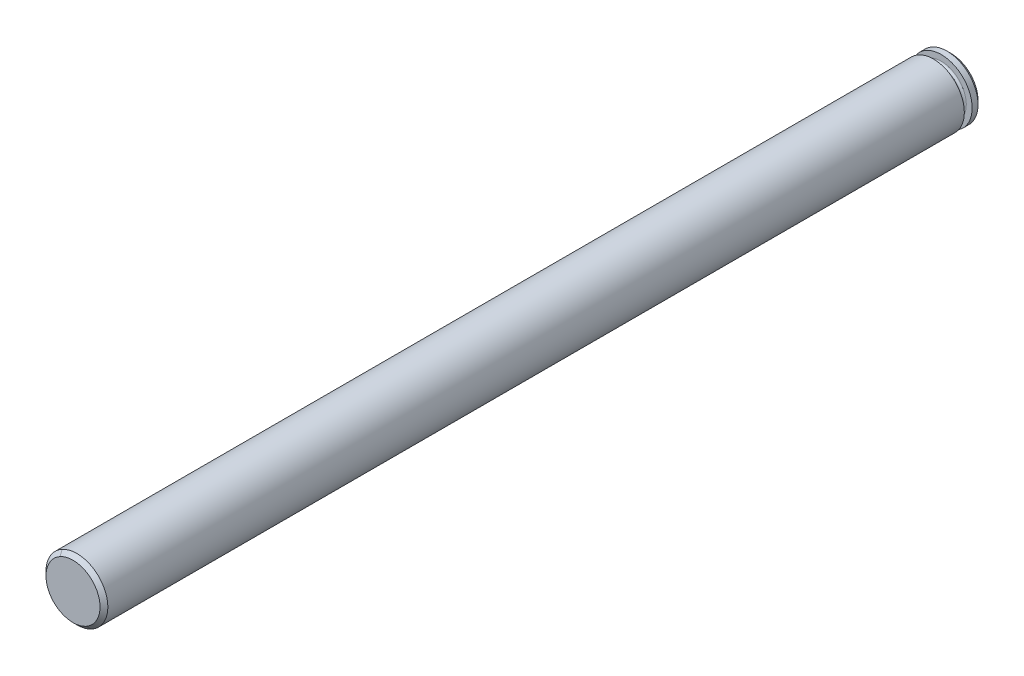
ISO-10303-21;
HEADER;
FILE_DESCRIPTION(('STEP AP214'),'2;1');
FILE_NAME('part.step','',(''),(''),'','','');
FILE_SCHEMA(('AUTOMOTIVE_DESIGN { 1 0 10303 214 1 1 1 1 }'));
ENDSEC;
DATA;
#1=APPLICATION_CONTEXT('core data for automotive mechanical design processes');
#2=APPLICATION_PROTOCOL_DEFINITION('international standard','automotive_design',2000,#1);
#3=PRODUCT_CONTEXT('',#1,'mechanical');
#4=PRODUCT('Part','Part','',(#3));
#5=PRODUCT_RELATED_PRODUCT_CATEGORY('part','',(#4));
#6=PRODUCT_DEFINITION_FORMATION('','',#4);
#7=PRODUCT_DEFINITION_CONTEXT('part definition',#1,'design');
#8=PRODUCT_DEFINITION('design','',#6,#7);
#9=PRODUCT_DEFINITION_SHAPE('','',#8);
#10=(LENGTH_UNIT() NAMED_UNIT(*) SI_UNIT(.MILLI.,.METRE.));
#11=(NAMED_UNIT(*) PLANE_ANGLE_UNIT() SI_UNIT($,.RADIAN.));
#12=(NAMED_UNIT(*) SI_UNIT($,.STERADIAN.) SOLID_ANGLE_UNIT());
#13=UNCERTAINTY_MEASURE_WITH_UNIT(LENGTH_MEASURE(1.E-05),#10,'distance_accuracy_value','');
#14=(GEOMETRIC_REPRESENTATION_CONTEXT(3) GLOBAL_UNCERTAINTY_ASSIGNED_CONTEXT((#13)) GLOBAL_UNIT_ASSIGNED_CONTEXT((#10,
#11,#12)) REPRESENTATION_CONTEXT('',''));
#15=CARTESIAN_POINT('',(0.,0.,0.));
#16=DIRECTION('',(0.,0.,1.));
#17=DIRECTION('',(1.,0.,0.));
#18=AXIS2_PLACEMENT_3D('',#15,#16,#17);
#19=CARTESIAN_POINT('',(0.,0.,0.));
#20=DIRECTION('',(0.,0.,1.));
#21=DIRECTION('',(1.,0.,0.));
#22=AXIS2_PLACEMENT_3D('',#19,#20,#21);
#23=PLANE('',#22);
#24=CARTESIAN_POINT('',(0.,0.,-1.13684533791999E-10));
#25=DIRECTION('',(0.,0.,1.));
#26=DIRECTION('',(1.,0.,0.));
#27=AXIS2_PLACEMENT_3D('',#24,#25,#26);
#28=CIRCLE('',#27,1.38499999997066);
#29=CARTESIAN_POINT('',(-0.66400437095998,1.21545184822052,-3.04662098749089E-11));
#30=VERTEX_POINT('',#29);
#31=CARTESIAN_POINT('',(0.664003718689585,-1.21545220462232,2.83070135728416E-11));
#32=VERTEX_POINT('',#31);
#33=EDGE_CURVE('E144',#30,#32,#28,.T.);
#34=ORIENTED_EDGE('',*,*,#33,.F.);
#35=CARTESIAN_POINT('',(0.,-3.1170880873187E-13,5.46819263046866E-11));
#36=DIRECTION('',(0.,1.56071244751136E-12,1.));
#37=DIRECTION('',(0.,-1.,1.56071244751136E-12));
#38=AXIS2_PLACEMENT_3D('',#35,#36,#37);
#39=CIRCLE('',#38,1.38500000002719);
#40=EDGE_CURVE('E21',#32,#30,#39,.T.);
#41=ORIENTED_EDGE('',*,*,#40,.F.);
#42=EDGE_LOOP('',(#34,#41));
#43=FACE_BOUND('',#42,.T.);
#44=ADVANCED_FACE('F17',(#43),#23,.F.);
#45=CARTESIAN_POINT('',(0.,0.,0.200000000117852));
#46=DIRECTION('',(0.,1.56071244751136E-12,1.));
#47=DIRECTION('',(0.,-1.,1.56071244751136E-12));
#48=AXIS2_PLACEMENT_3D('',#45,#46,#47);
#49=CONICAL_SURFACE('',#48,1.5849999999773,0.785398163114792);
#50=CARTESIAN_POINT('',(0.664003718703219,-1.21545220464728,0.));
#51=CARTESIAN_POINT('',(0.667998954785312,-1.2227653799699,0.00833333331681347));
#52=CARTESIAN_POINT('',(0.671994191348765,-1.23007855500759,0.0166666666529012));
#53=CARTESIAN_POINT('',(0.679984665447788,-1.2447049045303,0.0333333333250767));
#54=CARTESIAN_POINT('',(0.683979902983358,-1.25201807901532,0.0416666666611645));
#55=CARTESIAN_POINT('',(0.691970379049638,-1.26664442747485,0.0583333333232102));
#56=CARTESIAN_POINT('',(0.695965617580349,-1.27395760144936,0.0666666666491682));
#57=CARTESIAN_POINT('',(0.703956095626256,-1.28858394886835,0.0833333333321294));
#58=CARTESIAN_POINT('',(0.707951335141453,-1.29589712231283,0.0916666666891326));
#59=CARTESIAN_POINT('',(0.715941815144136,-1.31052346864946,0.108333333326983));
#60=CARTESIAN_POINT('',(0.719937055631622,-1.3178366415416,0.116666666607831));
#61=CARTESIAN_POINT('',(0.727927537592898,-1.33246298679919,0.133333333272573));
#62=CARTESIAN_POINT('',(0.731922779066687,-1.33977615916463,0.141666666656468));
#63=CARTESIAN_POINT('',(0.739913262997597,-1.35440250336339,0.15833333334402));
#64=CARTESIAN_POINT('',(0.743908505454717,-1.3617156751967,0.166666666647678));
#65=CARTESIAN_POINT('',(0.751898991350158,-1.37634201832728,0.183333333273942));
#66=CARTESIAN_POINT('',(0.755894234788479,-1.38365518962456,0.191666666596547));
#67=CARTESIAN_POINT('',(0.759889478702709,-1.39096836062693,0.199999999949797));
#68=B_SPLINE_CURVE_WITH_KNOTS('',3,(#50,#51,#52,#53,#54,#55,#56,#57,#58,#59,#60,#61,#62,#63,#64,
#65,#66,#67),.UNSPECIFIED.,.F.,.F.,(4,2,2,2,2,2,2,2,4),(0.,0.0353553390505766,
0.0707106780609635,0.106066017111549,0.141421356242528,0.176776695172541,0.212132034343724,
0.247487373354134,0.282842712404744),.UNSPECIFIED.);
#69=CARTESIAN_POINT('',(0.759889478679084,-1.39096836058368,0.19999999998539));
#70=VERTEX_POINT('',#69);
#71=EDGE_CURVE('E165',#32,#70,#68,.T.);
#72=ORIENTED_EDGE('',*,*,#71,.F.);
#73=ORIENTED_EDGE('',*,*,#40,.T.);
#74=CARTESIAN_POINT('',(-0.759889478702583,1.39096836062699,0.1999999999498));
#75=CARTESIAN_POINT('',(-0.755894265891157,1.3836551726306,0.191666666598736));
#76=CARTESIAN_POINT('',(-0.751899053066615,1.37634198461019,0.183333333275037));
#77=CARTESIAN_POINT('',(-0.743908627417539,1.36171560856936,0.166666666646588));
#78=CARTESIAN_POINT('',(-0.739913414593005,1.35440242054894,0.158333333341837));
#79=CARTESIAN_POINT('',(-0.731922988942931,1.33977604450625,0.141666666658657));
#80=CARTESIAN_POINT('',(-0.727927776117391,1.33246285648397,0.133333333280228));
#81=CARTESIAN_POINT('',(-0.719937350470372,1.31783648044683,0.11666666657176));
#82=CARTESIAN_POINT('',(-0.715942137648892,1.31052329243197,0.108333333241721));
#83=CARTESIAN_POINT('',(-0.707951712004369,1.29589691639937,0.0916666666038699));
#84=CARTESIAN_POINT('',(-0.703956499181324,1.28858372838163,0.0833333332960581));
#85=CARTESIAN_POINT('',(-0.695966073537479,1.27395735235023,0.0666666666568226));
#86=CARTESIAN_POINT('',(-0.691970860716678,1.26664416433657,0.058333333325399));
#87=CARTESIAN_POINT('',(-0.68398043508588,1.25201778832902,0.0416666666589807));
#88=CARTESIAN_POINT('',(-0.679985222275884,1.24470460033513,0.033333333323986));
#89=CARTESIAN_POINT('',(-0.671994796628645,1.23007822429745,0.0166666666161012));
#90=CARTESIAN_POINT('',(-0.667999583791403,1.22276503625366,0.00833333324321093));
#91=CARTESIAN_POINT('',(-0.664004370946496,1.21545184819584,-1.13682963543059E-10));
#92=B_SPLINE_CURVE_WITH_KNOTS('',3,(#74,#75,#76,#77,#78,#79,#80,#81,#82,#83,#84,#85,#86,#87,#88,
#89,#90,#91),.UNSPECIFIED.,.F.,.F.,(4,2,2,2,2,2,2,2,4),(0.,0.0353553390504523,
0.0707106780607104,0.106066017231746,0.141421356282199,0.176776695292457,0.212132034342909,
0.247487373353167,0.282842712564397),.UNSPECIFIED.);
#93=CARTESIAN_POINT('',(-0.759889478691671,1.39096836060702,0.199999999988556));
#94=VERTEX_POINT('',#93);
#95=EDGE_CURVE('E164',#94,#30,#92,.T.);
#96=ORIENTED_EDGE('',*,*,#95,.F.);
#97=CARTESIAN_POINT('',(0.,0.,0.199999999999999));
#98=DIRECTION('',(0.,0.,1.));
#99=DIRECTION('',(1.,0.,0.));
#100=AXIS2_PLACEMENT_3D('',#97,#98,#99);
#101=CIRCLE('',#100,1.585);
#102=EDGE_CURVE('E136',#70,#94,#101,.T.);
#103=ORIENTED_EDGE('',*,*,#102,.F.);
#104=EDGE_LOOP('',(#72,#73,#96,#103));
#105=FACE_BOUND('',#104,.T.);
#106=ADVANCED_FACE('F263',(#105),#49,.T.);
#107=CARTESIAN_POINT('',(0.,0.,0.199999999949799));
#108=DIRECTION('',(0.,0.,1.));
#109=DIRECTION('',(1.,0.,0.));
#110=AXIS2_PLACEMENT_3D('',#107,#108,#109);
#111=CONICAL_SURFACE('',#110,1.58500000003414,0.785398163397446);
#112=ORIENTED_EDGE('',*,*,#95,.T.);
#113=ORIENTED_EDGE('',*,*,#33,.T.);
#114=ORIENTED_EDGE('',*,*,#71,.T.);
#115=CARTESIAN_POINT('',(0.,0.,0.199999999999999));
#116=DIRECTION('',(0.,0.,1.));
#117=DIRECTION('',(1.,0.,0.));
#118=AXIS2_PLACEMENT_3D('',#115,#116,#117);
#119=CIRCLE('',#118,1.585);
#120=EDGE_CURVE('E67',#94,#70,#119,.T.);
#121=ORIENTED_EDGE('',*,*,#120,.F.);
#122=EDGE_LOOP('',(#112,#113,#114,#121));
#123=FACE_BOUND('',#122,.T.);
#124=ADVANCED_FACE('F152',(#123),#111,.T.);
#125=CARTESIAN_POINT('',(0.,0.,22.5));
#126=DIRECTION('',(0.,0.,1.));
#127=DIRECTION('',(1.,0.,0.));
#128=AXIS2_PLACEMENT_3D('',#125,#126,#127);
#129=CYLINDRICAL_SURFACE('',#128,1.585);
#130=ORIENTED_EDGE('',*,*,#102,.T.);
#131=ORIENTED_EDGE('',*,*,#120,.T.);
#132=EDGE_LOOP('',(#130,#131));
#133=FACE_BOUND('',#132,.T.);
#134=CARTESIAN_POINT('',(0.,0.,0.5));
#135=DIRECTION('',(0.,0.,1.));
#136=DIRECTION('',(1.,0.,0.));
#137=AXIS2_PLACEMENT_3D('',#134,#135,#136);
#138=CIRCLE('',#137,1.585);
#139=CARTESIAN_POINT('',(1.585,0.,0.5));
#140=VERTEX_POINT('',#139);
#141=EDGE_CURVE('E173',#140,#140,#138,.T.);
#142=ORIENTED_EDGE('',*,*,#141,.F.);
#143=EDGE_LOOP('',(#142));
#144=FACE_BOUND('',#143,.T.);
#145=ADVANCED_FACE('F125',(#133,#144),#129,.T.);
#146=CARTESIAN_POINT('',(0.,0.,0.5));
#147=DIRECTION('',(0.,0.,1.));
#148=DIRECTION('',(1.,0.,0.));
#149=AXIS2_PLACEMENT_3D('',#146,#147,#148);
#150=PLANE('',#149);
#151=ORIENTED_EDGE('',*,*,#141,.T.);
#152=EDGE_LOOP('',(#151));
#153=FACE_BOUND('',#152,.T.);
#154=CARTESIAN_POINT('',(-1.285,0.,0.5));
#155=CARTESIAN_POINT('',(-1.28460963819934,0.245608885540331,0.5));
#156=CARTESIAN_POINT('',(-1.19477796686522,0.473001701787004,0.5));
#157=CARTESIAN_POINT('',(-1.09735684772444,0.719605848346081,0.5));
#158=CARTESIAN_POINT('',(-0.908632213824716,0.908632213824711,0.5));
#159=CARTESIAN_POINT('',(-0.721348493029524,1.09621536247737,0.5));
#160=CARTESIAN_POINT('',(-0.47300170178701,1.19477796686522,0.5));
#161=CARTESIAN_POINT('',(-0.246164674872578,1.28480388599398,0.5));
#162=CARTESIAN_POINT('',(0.,1.285,0.5));
#163=CARTESIAN_POINT('',(0.244128452505779,1.28519449179225,0.5));
#164=CARTESIAN_POINT('',(0.473001701787002,1.19477796686523,0.5));
#165=CARTESIAN_POINT('',(0.719605861946416,1.09735683414576,0.5));
#166=CARTESIAN_POINT('',(0.90863221382471,0.908632213824716,0.5));
#167=CARTESIAN_POINT('',(1.09621513009313,0.721348725042878,0.5));
#168=CARTESIAN_POINT('',(1.19477796686522,0.473001701787009,0.5));
#169=CARTESIAN_POINT('',(1.28460837969041,0.246657611523395,0.5));
#170=CARTESIAN_POINT('',(1.285,0.,0.5));
#171=B_SPLINE_CURVE_WITH_KNOTS('',2,(#154,#155,#156,#157,#158,#159,#160,#161,#162,#163,#164,
#165,#166,#167,#168,#169,#170),.UNSPECIFIED.,.F.,.F.,(3,2,2,2,2,2,2,2,3),(0.,0.125,0.25,0.375,
0.5,0.625,0.75,0.875,1.),.UNSPECIFIED.);
#172=CARTESIAN_POINT('',(-1.285,0.,0.5));
#173=VERTEX_POINT('',#172);
#174=CARTESIAN_POINT('',(1.285,0.,0.5));
#175=VERTEX_POINT('',#174);
#176=EDGE_CURVE('E129',#173,#175,#171,.T.);
#177=ORIENTED_EDGE('',*,*,#176,.T.);
#178=CARTESIAN_POINT('',(0.,0.,0.5));
#179=DIRECTION('',(0.,0.,1.));
#180=DIRECTION('',(0.,-1.,0.));
#181=AXIS2_PLACEMENT_3D('',#178,#179,#180);
#182=CIRCLE('',#181,1.285);
#183=EDGE_CURVE('E134',#175,#173,#182,.F.);
#184=ORIENTED_EDGE('',*,*,#183,.T.);
#185=EDGE_LOOP('',(#177,#184));
#186=FACE_BOUND('',#185,.T.);
#187=ADVANCED_FACE('F121',(#153,#186),#150,.T.);
#188=CARTESIAN_POINT('',(0.,0.,0.6));
#189=DIRECTION('',(0.,0.,1.));
#190=DIRECTION('',(0.,-1.,0.));
#191=AXIS2_PLACEMENT_3D('',#188,#189,#190);
#192=TOROIDAL_SURFACE('',#191,1.285,0.1);
#193=ORIENTED_EDGE('',*,*,#176,.F.);
#194=ORIENTED_EDGE('',*,*,#183,.F.);
#195=EDGE_LOOP('',(#193,#194));
#196=FACE_BOUND('',#195,.T.);
#197=CARTESIAN_POINT('',(0.,0.,0.6));
#198=DIRECTION('',(0.,0.,1.));
#199=DIRECTION('',(1.,0.,0.));
#200=AXIS2_PLACEMENT_3D('',#197,#198,#199);
#201=CIRCLE('',#200,1.185);
#202=CARTESIAN_POINT('',(1.185,0.,0.6));
#203=VERTEX_POINT('',#202);
#204=EDGE_CURVE('E133',#203,#203,#201,.T.);
#205=ORIENTED_EDGE('',*,*,#204,.F.);
#206=EDGE_LOOP('',(#205));
#207=FACE_BOUND('',#206,.T.);
#208=ADVANCED_FACE('F119',(#196,#207),#192,.F.);
#209=CARTESIAN_POINT('',(0.,0.,0.7));
#210=DIRECTION('',(0.,0.,1.));
#211=DIRECTION('',(1.,0.,0.));
#212=AXIS2_PLACEMENT_3D('',#209,#210,#211);
#213=CYLINDRICAL_SURFACE('',#212,1.185);
#214=CARTESIAN_POINT('',(0.,0.,0.8));
#215=DIRECTION('',(0.,0.,-1.));
#216=DIRECTION('',(0.,1.,0.));
#217=AXIS2_PLACEMENT_3D('',#214,#215,#216);
#218=CIRCLE('',#217,1.185);
#219=CARTESIAN_POINT('',(0.,1.185,0.8));
#220=VERTEX_POINT('',#219);
#221=EDGE_CURVE('E87',#220,#220,#218,.T.);
#222=ORIENTED_EDGE('',*,*,#221,.T.);
#223=EDGE_LOOP('',(#222));
#224=FACE_BOUND('',#223,.T.);
#225=ORIENTED_EDGE('',*,*,#204,.T.);
#226=EDGE_LOOP('',(#225));
#227=FACE_BOUND('',#226,.T.);
#228=ADVANCED_FACE('F116',(#224,#227),#213,.T.);
#229=CARTESIAN_POINT('',(0.,0.,0.8));
#230=DIRECTION('',(0.,0.,1.));
#231=DIRECTION('',(0.,-1.,0.));
#232=AXIS2_PLACEMENT_3D('',#229,#230,#231);
#233=TOROIDAL_SURFACE('',#232,1.285,0.1);
#234=ORIENTED_EDGE('',*,*,#221,.F.);
#235=EDGE_LOOP('',(#234));
#236=FACE_BOUND('',#235,.T.);
#237=CARTESIAN_POINT('',(0.,0.,0.9));
#238=DIRECTION('',(0.,0.,1.));
#239=DIRECTION('',(0.,-1.,0.));
#240=AXIS2_PLACEMENT_3D('',#237,#238,#239);
#241=CIRCLE('',#240,1.285);
#242=CARTESIAN_POINT('',(0.,-1.285,0.9));
#243=VERTEX_POINT('',#242);
#244=EDGE_CURVE('E78',#243,#243,#241,.F.);
#245=ORIENTED_EDGE('',*,*,#244,.T.);
#246=EDGE_LOOP('',(#245));
#247=FACE_BOUND('',#246,.T.);
#248=ADVANCED_FACE('F19',(#236,#247),#233,.F.);
#249=CARTESIAN_POINT('',(0.,0.,44.8000000000636));
#250=DIRECTION('',(0.,1.56289282254281E-12,-1.));
#251=DIRECTION('',(0.,1.,1.56289282254281E-12));
#252=AXIS2_PLACEMENT_3D('',#249,#250,#251);
#253=CONICAL_SURFACE('',#252,1.5849999999773,0.785398163395886);
#254=CARTESIAN_POINT('',(0.66400371867625,-1.21545220459791,45.0000000000118));
#255=CARTESIAN_POINT('',(0.667998954752521,-1.22276537990987,44.9916666666829));
#256=CARTESIAN_POINT('',(0.671994191317734,-1.23007855495078,44.9833333333505));
#257=CARTESIAN_POINT('',(0.679984665429359,-1.24470490449655,44.9666666666856));
#258=CARTESIAN_POINT('',(0.683979902975772,-1.25201807900143,44.9583333333532));
#259=CARTESIAN_POINT('',(0.691970379062197,-1.26664442749783,44.9416666666763));
#260=CARTESIAN_POINT('',(0.69596561760221,-1.27395760148936,44.9333333333319));
#261=CARTESIAN_POINT('',(0.70395609562747,-1.28858394887056,44.9166666666627));
#262=CARTESIAN_POINT('',(0.707951335112717,-1.29589712226022,44.9083333333379));
#263=CARTESIAN_POINT('',(0.715941815114114,-1.3105234685945,44.8916666666785));
#264=CARTESIAN_POINT('',(0.719937055630265,-1.31783664153911,44.8833333333437));
#265=CARTESIAN_POINT('',(0.727927537603562,-1.3324629868187,44.8666666666662));
#266=CARTESIAN_POINT('',(0.731922779060708,-1.33977615915368,44.8583333333234));
#267=CARTESIAN_POINT('',(0.73991326297193,-1.3544025033164,44.8416666666516));
#268=CARTESIAN_POINT('',(0.743908505426005,-1.36171567514413,44.8333333333226));
#269=CARTESIAN_POINT('',(0.751898991315355,-1.37634201826357,44.8166666666836));
#270=CARTESIAN_POINT('',(0.75589423475063,-1.38365518955528,44.8083333333736));
#271=CARTESIAN_POINT('',(0.759889478675456,-1.39096836057704,44.8000000000614));
#272=B_SPLINE_CURVE_WITH_KNOTS('',3,(#254,#255,#256,#257,#258,#259,#260,#261,#262,#263,#264,
#265,#266,#267,#268,#269,#270,#271),.UNSPECIFIED.,.F.,.F.,(4,2,2,2,2,2,2,2,4),(0.,
0.0353553390505784,0.0707106781011665,0.106066017232133,0.141421356162147,0.176776695333317,
0.212132034343724,0.247487373394336,0.282842712404743),.UNSPECIFIED.);
#273=CARTESIAN_POINT('',(0.664003718663142,-1.21545220457392,45.0000000000392));
#274=VERTEX_POINT('',#273);
#275=CARTESIAN_POINT('',(0.759889478680898,-1.390968360587,44.8000000000325));
#276=VERTEX_POINT('',#275);
#277=EDGE_CURVE('E36',#274,#276,#272,.T.);
#278=ORIENTED_EDGE('',*,*,#277,.T.);
#279=CARTESIAN_POINT('',(0.,0.,44.8));
#280=DIRECTION('',(0.,0.,1.));
#281=DIRECTION('',(1.,0.,0.));
#282=AXIS2_PLACEMENT_3D('',#279,#280,#281);
#283=CIRCLE('',#282,1.585);
#284=CARTESIAN_POINT('',(-0.759889478688566,1.39096836058712,44.8000000000194));
#285=VERTEX_POINT('',#284);
#286=EDGE_CURVE('E72',#285,#276,#283,.F.);
#287=ORIENTED_EDGE('',*,*,#286,.F.);
#288=CARTESIAN_POINT('',(-0.759889478681311,1.39096836057384,44.8000000000659));
#289=CARTESIAN_POINT('',(-0.75589426585728,1.38365517255245,44.80833333337));
#290=CARTESIAN_POINT('',(-0.751899053037973,1.37634198453972,44.816666666684));
#291=CARTESIAN_POINT('',(-0.743908627399342,1.36171560851428,44.833333333331));
#292=CARTESIAN_POINT('',(-0.739913414580017,1.35440242050157,44.8416666666639));
#293=CARTESIAN_POINT('',(-0.731922988931879,1.33977604445882,44.858333333348));
#294=CARTESIAN_POINT('',(-0.727927776103067,1.33246285642878,44.8666666666991));
#295=CARTESIAN_POINT('',(-0.719937350451502,1.31783648037985,44.8833333333761));
#296=CARTESIAN_POINT('',(-0.71594213762875,1.31052329236095,44.891666666702));
#297=CARTESIAN_POINT('',(-0.707951712000172,1.29589691635418,44.9083333333701));
#298=CARTESIAN_POINT('',(-0.703956499194347,1.28858372836631,44.9166666667124));
#299=CARTESIAN_POINT('',(-0.695966073545152,1.2739573523219,44.9333333333945));
#300=CARTESIAN_POINT('',(-0.691970860701783,1.26664416426535,44.9416666667343));
#301=CARTESIAN_POINT('',(-0.68398043503917,1.25201778819646,44.9583333334074));
#302=CARTESIAN_POINT('',(-0.679985222219925,1.24470460018412,44.9666666667407));
#303=CARTESIAN_POINT('',(-0.6719947965905,1.23007822417607,44.9833333334074));
#304=CARTESIAN_POINT('',(-0.66799958378032,1.22276503618036,44.9916666667407));
#305=CARTESIAN_POINT('',(-0.664004370969415,1.21545184818335,45.0000000000725));
#306=B_SPLINE_CURVE_WITH_KNOTS('',3,(#288,#289,#290,#291,#292,#293,#294,#295,#296,#297,#298,
#299,#300,#301,#302,#303,#304,#305),.UNSPECIFIED.,.F.,.F.,(4,2,2,2,2,2,2,2,4),(0.,
0.03535533901026,0.0707106780607097,0.106066017191553,0.141421356242007,0.176776695252262,
0.2121320344233,0.24748737347375,0.282842712484009),.UNSPECIFIED.);
#307=CARTESIAN_POINT('',(-0.664004370969407,1.21545184818334,45.0000000000158));
#308=VERTEX_POINT('',#307);
#309=EDGE_CURVE('E81',#285,#308,#306,.T.);
#310=ORIENTED_EDGE('',*,*,#309,.T.);
#311=CARTESIAN_POINT('',(0.,-3.12253303864299E-13,45.0000000000684));
#312=DIRECTION('',(0.,1.56289282254281E-12,-1.));
#313=DIRECTION('',(0.,1.,1.56289282254281E-12));
#314=AXIS2_PLACEMENT_3D('',#311,#312,#313);
#315=CIRCLE('',#314,1.38499999997313);
#316=EDGE_CURVE('E83',#274,#308,#315,.F.);
#317=ORIENTED_EDGE('',*,*,#316,.F.);
#318=EDGE_LOOP('',(#278,#287,#310,#317));
#319=FACE_BOUND('',#318,.T.);
#320=ADVANCED_FACE('F82',(#319),#253,.T.);
#321=CARTESIAN_POINT('',(0.,1.585,45.));
#322=DIRECTION('',(0.,0.,1.));
#323=DIRECTION('',(1.,0.,0.));
#324=AXIS2_PLACEMENT_3D('',#321,#322,#323);
#325=PLANE('',#324);
#326=CARTESIAN_POINT('',(0.,0.,44.9999999999591));
#327=DIRECTION('',(0.,0.,-1.));
#328=DIRECTION('',(-1.,0.,0.));
#329=AXIS2_PLACEMENT_3D('',#326,#327,#328);
#330=CIRCLE('',#329,1.38499999997066);
#331=EDGE_CURVE('E77',#274,#308,#330,.T.);
#332=ORIENTED_EDGE('',*,*,#331,.F.);
#333=ORIENTED_EDGE('',*,*,#316,.T.);
#334=EDGE_LOOP('',(#332,#333));
#335=FACE_BOUND('',#334,.T.);
#336=ADVANCED_FACE('F107',(#335),#325,.T.);
#337=CARTESIAN_POINT('',(0.,0.,0.9));
#338=DIRECTION('',(0.,0.,1.));
#339=DIRECTION('',(1.,0.,0.));
#340=AXIS2_PLACEMENT_3D('',#337,#338,#339);
#341=PLANE('',#340);
#342=CARTESIAN_POINT('',(0.,0.,0.900000000000001));
#343=DIRECTION('',(0.,0.,1.));
#344=DIRECTION('',(1.,0.,0.));
#345=AXIS2_PLACEMENT_3D('',#342,#343,#344);
#346=CIRCLE('',#345,1.585);
#347=CARTESIAN_POINT('',(1.585,0.,0.900000000000001));
#348=VERTEX_POINT('',#347);
#349=EDGE_CURVE('E27',#348,#348,#346,.T.);
#350=ORIENTED_EDGE('',*,*,#349,.F.);
#351=EDGE_LOOP('',(#350));
#352=FACE_BOUND('',#351,.T.);
#353=ORIENTED_EDGE('',*,*,#244,.F.);
#354=EDGE_LOOP('',(#353));
#355=FACE_BOUND('',#354,.T.);
#356=ADVANCED_FACE('F183',(#352,#355),#341,.F.);
#357=CARTESIAN_POINT('',(0.,0.,44.7999999999524));
#358=DIRECTION('',(0.,0.,-1.));
#359=DIRECTION('',(-1.,0.,0.));
#360=AXIS2_PLACEMENT_3D('',#357,#358,#359);
#361=CONICAL_SURFACE('',#360,1.58500000003414,0.785398163539557);
#362=CARTESIAN_POINT('',(0.,0.,44.8000000000035));
#363=DIRECTION('',(0.,0.,1.));
#364=DIRECTION('',(1.,0.,0.));
#365=AXIS2_PLACEMENT_3D('',#362,#363,#364);
#366=CIRCLE('',#365,1.585);
#367=EDGE_CURVE('E11',#276,#285,#366,.F.);
#368=ORIENTED_EDGE('',*,*,#367,.F.);
#369=ORIENTED_EDGE('',*,*,#277,.F.);
#370=ORIENTED_EDGE('',*,*,#331,.T.);
#371=ORIENTED_EDGE('',*,*,#309,.F.);
#372=EDGE_LOOP('',(#368,#369,#370,#371));
#373=FACE_BOUND('',#372,.T.);
#374=ADVANCED_FACE('F80',(#373),#361,.T.);
#375=CARTESIAN_POINT('',(0.,0.,22.5));
#376=DIRECTION('',(0.,0.,1.));
#377=DIRECTION('',(1.,0.,0.));
#378=AXIS2_PLACEMENT_3D('',#375,#376,#377);
#379=CYLINDRICAL_SURFACE('',#378,1.585);
#380=ORIENTED_EDGE('',*,*,#349,.T.);
#381=EDGE_LOOP('',(#380));
#382=FACE_BOUND('',#381,.T.);
#383=ORIENTED_EDGE('',*,*,#286,.T.);
#384=ORIENTED_EDGE('',*,*,#367,.T.);
#385=EDGE_LOOP('',(#383,#384));
#386=FACE_BOUND('',#385,.T.);
#387=ADVANCED_FACE('F73',(#382,#386),#379,.T.);
#388=CLOSED_SHELL('',(#44,#106,#124,#145,#187,#208,#228,#248,#320,#336,#356,#374,#387));
#389=MANIFOLD_SOLID_BREP('B1',#388);
#390=ADVANCED_BREP_SHAPE_REPRESENTATION('',(#18,#389),#14);
#391=SHAPE_DEFINITION_REPRESENTATION(#9,#390);
ENDSEC;
END-ISO-10303-21;
